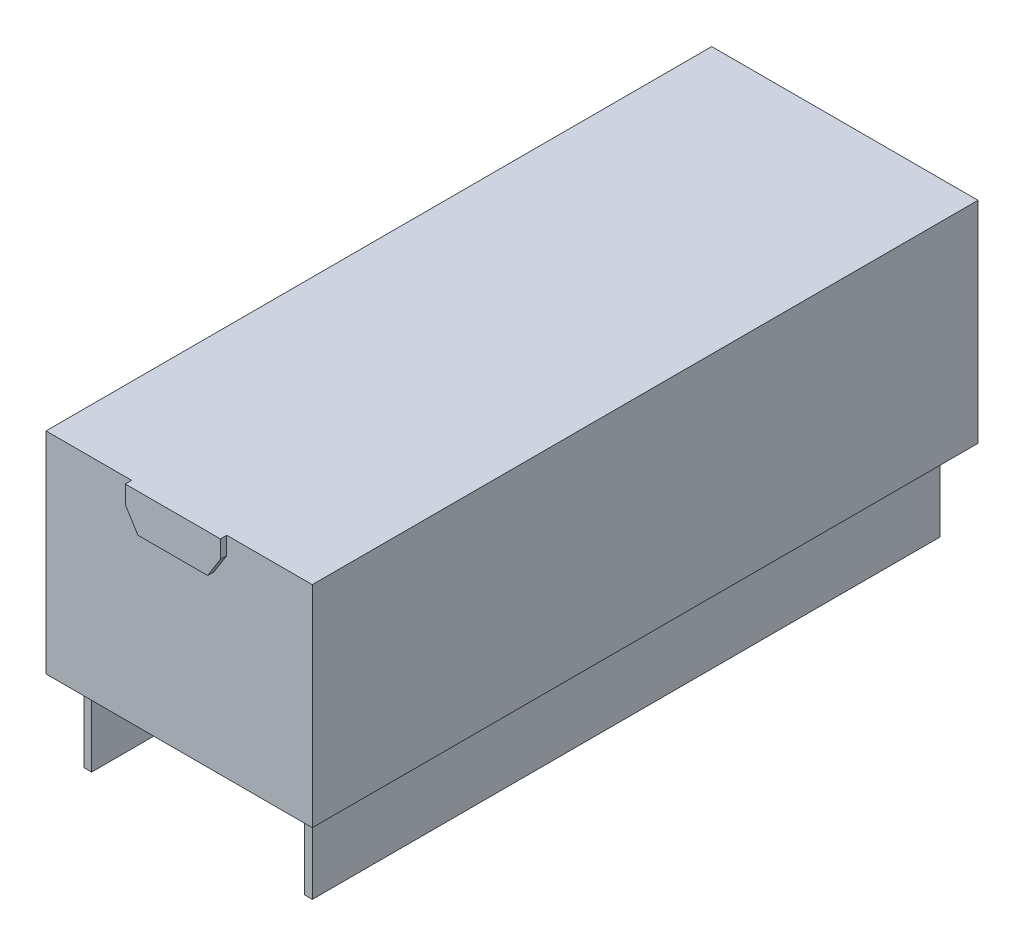
ISO-10303-21;
HEADER;
FILE_DESCRIPTION(('STEP AP214'),'2;1');
FILE_NAME('part.step','',(''),(''),'','','');
FILE_SCHEMA(('AUTOMOTIVE_DESIGN { 1 0 10303 214 1 1 1 1 }'));
ENDSEC;
DATA;
#1=APPLICATION_CONTEXT('core data for automotive mechanical design processes');
#2=APPLICATION_PROTOCOL_DEFINITION('international standard','automotive_design',2000,#1);
#3=PRODUCT_CONTEXT('',#1,'mechanical');
#4=PRODUCT('Part','Part','',(#3));
#5=PRODUCT_RELATED_PRODUCT_CATEGORY('part','',(#4));
#6=PRODUCT_DEFINITION_FORMATION('','',#4);
#7=PRODUCT_DEFINITION_CONTEXT('part definition',#1,'design');
#8=PRODUCT_DEFINITION('design','',#6,#7);
#9=PRODUCT_DEFINITION_SHAPE('','',#8);
#10=(LENGTH_UNIT() NAMED_UNIT(*) SI_UNIT(.MILLI.,.METRE.));
#11=(NAMED_UNIT(*) PLANE_ANGLE_UNIT() SI_UNIT($,.RADIAN.));
#12=(NAMED_UNIT(*) SI_UNIT($,.STERADIAN.) SOLID_ANGLE_UNIT());
#13=UNCERTAINTY_MEASURE_WITH_UNIT(LENGTH_MEASURE(1.E-05),#10,'distance_accuracy_value','');
#14=(GEOMETRIC_REPRESENTATION_CONTEXT(3) GLOBAL_UNCERTAINTY_ASSIGNED_CONTEXT((#13)) GLOBAL_UNIT_ASSIGNED_CONTEXT((#10,
#11,#12)) REPRESENTATION_CONTEXT('',''));
#15=CARTESIAN_POINT('',(0.,0.,0.));
#16=DIRECTION('',(0.,0.,1.));
#17=DIRECTION('',(1.,0.,0.));
#18=AXIS2_PLACEMENT_3D('',#15,#16,#17);
#19=CARTESIAN_POINT('',(0.,0.,0.));
#20=DIRECTION('',(0.,1.,0.));
#21=DIRECTION('',(0.,0.,1.));
#22=AXIS2_PLACEMENT_3D('',#19,#20,#21);
#23=PLANE('',#22);
#24=DIRECTION('',(0.,0.,-1.));
#25=VECTOR('',#24,1.);
#26=CARTESIAN_POINT('',(10.5,0.,-26.25));
#27=LINE('',#26,#25);
#28=CARTESIAN_POINT('',(10.5,0.,26.25));
#29=VERTEX_POINT('',#28);
#30=CARTESIAN_POINT('',(10.5,0.,-26.25));
#31=VERTEX_POINT('',#30);
#32=EDGE_CURVE('E316',#29,#31,#27,.T.);
#33=ORIENTED_EDGE('',*,*,#32,.F.);
#34=DIRECTION('',(1.,0.,0.));
#35=VECTOR('',#34,1.);
#36=CARTESIAN_POINT('',(-10.5,0.,26.25));
#37=LINE('',#36,#35);
#38=CARTESIAN_POINT('',(-10.5,0.,26.25));
#39=VERTEX_POINT('',#38);
#40=EDGE_CURVE('E322',#39,#29,#37,.T.);
#41=ORIENTED_EDGE('',*,*,#40,.F.);
#42=DIRECTION('',(0.,0.,1.));
#43=VECTOR('',#42,1.);
#44=CARTESIAN_POINT('',(-10.5,0.,-26.25));
#45=LINE('',#44,#43);
#46=CARTESIAN_POINT('',(-10.5,0.,-26.25));
#47=VERTEX_POINT('',#46);
#48=EDGE_CURVE('E340',#47,#39,#45,.T.);
#49=ORIENTED_EDGE('',*,*,#48,.F.);
#50=DIRECTION('',(-1.,0.,0.));
#51=VECTOR('',#50,1.);
#52=CARTESIAN_POINT('',(-10.5,0.,-26.25));
#53=LINE('',#52,#51);
#54=EDGE_CURVE('E337',#31,#47,#53,.T.);
#55=ORIENTED_EDGE('',*,*,#54,.F.);
#56=EDGE_LOOP('',(#33,#41,#49,#55));
#57=FACE_BOUND('',#56,.T.);
#58=DIRECTION('',(0.,0.,-1.));
#59=VECTOR('',#58,1.);
#60=CARTESIAN_POINT('',(-9.00000000000002,0.,24.75));
#61=LINE('',#60,#59);
#62=CARTESIAN_POINT('',(-9.00000000000002,0.,24.75));
#63=VERTEX_POINT('',#62);
#64=CARTESIAN_POINT('',(-8.99999999999999,0.,-24.75));
#65=VERTEX_POINT('',#64);
#66=EDGE_CURVE('E224',#63,#65,#61,.T.);
#67=ORIENTED_EDGE('',*,*,#66,.F.);
#68=DIRECTION('',(1.,0.,0.));
#69=VECTOR('',#68,1.);
#70=CARTESIAN_POINT('',(-9.00000000000002,0.,24.75));
#71=LINE('',#70,#69);
#72=CARTESIAN_POINT('',(-8.40000000000002,0.,24.75));
#73=VERTEX_POINT('',#72);
#74=EDGE_CURVE('E198',#63,#73,#71,.T.);
#75=ORIENTED_EDGE('',*,*,#74,.T.);
#76=DIRECTION('',(0.,0.,-1.));
#77=VECTOR('',#76,1.);
#78=CARTESIAN_POINT('',(-8.40000000000002,0.,24.75));
#79=LINE('',#78,#77);
#80=CARTESIAN_POINT('',(-8.39999999999999,0.,-24.75));
#81=VERTEX_POINT('',#80);
#82=EDGE_CURVE('E203',#73,#81,#79,.T.);
#83=ORIENTED_EDGE('',*,*,#82,.T.);
#84=DIRECTION('',(1.,0.,0.));
#85=VECTOR('',#84,1.);
#86=CARTESIAN_POINT('',(-8.99999999999999,0.,-24.75));
#87=LINE('',#86,#85);
#88=EDGE_CURVE('E69',#65,#81,#87,.T.);
#89=ORIENTED_EDGE('',*,*,#88,.F.);
#90=EDGE_LOOP('',(#67,#75,#83,#89));
#91=FACE_BOUND('',#90,.T.);
#92=DIRECTION('',(-1.,0.,0.));
#93=VECTOR('',#92,1.);
#94=CARTESIAN_POINT('',(9.00000000000002,0.,24.75));
#95=LINE('',#94,#93);
#96=CARTESIAN_POINT('',(9.00000000000002,0.,24.75));
#97=VERTEX_POINT('',#96);
#98=CARTESIAN_POINT('',(8.40000000000002,0.,24.75));
#99=VERTEX_POINT('',#98);
#100=EDGE_CURVE('E178',#97,#99,#95,.T.);
#101=ORIENTED_EDGE('',*,*,#100,.F.);
#102=DIRECTION('',(0.,0.,-1.));
#103=VECTOR('',#102,1.);
#104=CARTESIAN_POINT('',(9.00000000000002,0.,24.75));
#105=LINE('',#104,#103);
#106=CARTESIAN_POINT('',(8.99999999999999,0.,-24.75));
#107=VERTEX_POINT('',#106);
#108=EDGE_CURVE('E190',#97,#107,#105,.T.);
#109=ORIENTED_EDGE('',*,*,#108,.T.);
#110=DIRECTION('',(-1.,0.,0.));
#111=VECTOR('',#110,1.);
#112=CARTESIAN_POINT('',(8.99999999999999,0.,-24.75));
#113=LINE('',#112,#111);
#114=CARTESIAN_POINT('',(8.39999999999999,0.,-24.75));
#115=VERTEX_POINT('',#114);
#116=EDGE_CURVE('E61',#107,#115,#113,.T.);
#117=ORIENTED_EDGE('',*,*,#116,.T.);
#118=DIRECTION('',(0.,0.,-1.));
#119=VECTOR('',#118,1.);
#120=CARTESIAN_POINT('',(8.40000000000002,0.,24.75));
#121=LINE('',#120,#119);
#122=EDGE_CURVE('E196',#99,#115,#121,.T.);
#123=ORIENTED_EDGE('',*,*,#122,.F.);
#124=EDGE_LOOP('',(#101,#109,#117,#123));
#125=FACE_BOUND('',#124,.T.);
#126=ADVANCED_FACE('F45',(#57,#91,#125),#23,.F.);
#127=CARTESIAN_POINT('',(-10.5,16.6,26.25));
#128=DIRECTION('',(0.,0.,-1.));
#129=DIRECTION('',(-1.,0.,0.));
#130=AXIS2_PLACEMENT_3D('',#127,#128,#129);
#131=PLANE('',#130);
#132=DIRECTION('',(0.,1.,0.));
#133=VECTOR('',#132,1.);
#134=CARTESIAN_POINT('',(3.75,16.6,26.25));
#135=LINE('',#134,#133);
#136=CARTESIAN_POINT('',(3.75,15.2,26.25));
#137=VERTEX_POINT('',#136);
#138=CARTESIAN_POINT('',(3.75,16.6,26.25));
#139=VERTEX_POINT('',#138);
#140=EDGE_CURVE('E259',#137,#139,#135,.T.);
#141=ORIENTED_EDGE('',*,*,#140,.F.);
#142=DIRECTION('',(0.52999894000318,0.847998304005088,0.));
#143=VECTOR('',#142,1.);
#144=CARTESIAN_POINT('',(2.75,13.6,26.25));
#145=LINE('',#144,#143);
#146=CARTESIAN_POINT('',(2.75,13.6,26.25));
#147=VERTEX_POINT('',#146);
#148=EDGE_CURVE('E286',#147,#137,#145,.T.);
#149=ORIENTED_EDGE('',*,*,#148,.F.);
#150=DIRECTION('',(1.,0.,0.));
#151=VECTOR('',#150,1.);
#152=CARTESIAN_POINT('',(-2.75,13.6,26.25));
#153=LINE('',#152,#151);
#154=CARTESIAN_POINT('',(-2.75,13.6,26.25));
#155=VERTEX_POINT('',#154);
#156=EDGE_CURVE('E282',#155,#147,#153,.T.);
#157=ORIENTED_EDGE('',*,*,#156,.F.);
#158=DIRECTION('',(0.529998940003181,-0.847998304005087,0.));
#159=VECTOR('',#158,1.);
#160=CARTESIAN_POINT('',(-3.75,15.2,26.25));
#161=LINE('',#160,#159);
#162=CARTESIAN_POINT('',(-3.75,15.2,26.25));
#163=VERTEX_POINT('',#162);
#164=EDGE_CURVE('E278',#163,#155,#161,.T.);
#165=ORIENTED_EDGE('',*,*,#164,.F.);
#166=DIRECTION('',(0.,-1.,0.));
#167=VECTOR('',#166,1.);
#168=CARTESIAN_POINT('',(-3.75,16.6,26.25));
#169=LINE('',#168,#167);
#170=CARTESIAN_POINT('',(-3.75,16.6,26.25));
#171=VERTEX_POINT('',#170);
#172=EDGE_CURVE('E245',#171,#163,#169,.T.);
#173=ORIENTED_EDGE('',*,*,#172,.F.);
#174=DIRECTION('',(1.,0.,0.));
#175=VECTOR('',#174,1.);
#176=CARTESIAN_POINT('',(-10.5,16.6,26.25));
#177=LINE('',#176,#175);
#178=CARTESIAN_POINT('',(-10.5,16.6,26.25));
#179=VERTEX_POINT('',#178);
#180=EDGE_CURVE('E329',#179,#171,#177,.T.);
#181=ORIENTED_EDGE('',*,*,#180,.F.);
#182=DIRECTION('',(0.,-1.,0.));
#183=VECTOR('',#182,1.);
#184=CARTESIAN_POINT('',(-10.5,16.6,26.25));
#185=LINE('',#184,#183);
#186=EDGE_CURVE('E348',#179,#39,#185,.T.);
#187=ORIENTED_EDGE('',*,*,#186,.T.);
#188=ORIENTED_EDGE('',*,*,#40,.T.);
#189=DIRECTION('',(0.,-1.,0.));
#190=VECTOR('',#189,1.);
#191=CARTESIAN_POINT('',(10.5,16.6,26.25));
#192=LINE('',#191,#190);
#193=CARTESIAN_POINT('',(10.5,16.6,26.25));
#194=VERTEX_POINT('',#193);
#195=EDGE_CURVE('E333',#194,#29,#192,.T.);
#196=ORIENTED_EDGE('',*,*,#195,.F.);
#197=EDGE_CURVE('E328',#139,#194,#177,.T.);
#198=ORIENTED_EDGE('',*,*,#197,.F.);
#199=EDGE_LOOP('',(#141,#149,#157,#165,#173,#181,#187,#188,#196,#198));
#200=FACE_BOUND('',#199,.T.);
#201=ADVANCED_FACE('F366',(#200),#131,.F.);
#202=CARTESIAN_POINT('',(10.5,16.6,-26.25));
#203=DIRECTION('',(-1.,0.,0.));
#204=DIRECTION('',(0.,0.,1.));
#205=AXIS2_PLACEMENT_3D('',#202,#203,#204);
#206=PLANE('',#205);
#207=ORIENTED_EDGE('',*,*,#32,.T.);
#208=DIRECTION('',(0.,-1.,0.));
#209=VECTOR('',#208,1.);
#210=CARTESIAN_POINT('',(10.5,16.6,-26.25));
#211=LINE('',#210,#209);
#212=CARTESIAN_POINT('',(10.5,16.6,-26.25));
#213=VERTEX_POINT('',#212);
#214=EDGE_CURVE('E11',#213,#31,#211,.T.);
#215=ORIENTED_EDGE('',*,*,#214,.F.);
#216=DIRECTION('',(0.,0.,-1.));
#217=VECTOR('',#216,1.);
#218=CARTESIAN_POINT('',(10.5,16.6,-26.25));
#219=LINE('',#218,#217);
#220=EDGE_CURVE('E317',#194,#213,#219,.T.);
#221=ORIENTED_EDGE('',*,*,#220,.F.);
#222=ORIENTED_EDGE('',*,*,#195,.T.);
#223=EDGE_LOOP('',(#207,#215,#221,#222));
#224=FACE_BOUND('',#223,.T.);
#225=ADVANCED_FACE('F47',(#224),#206,.F.);
#226=CARTESIAN_POINT('',(-10.5,16.6,-26.25));
#227=DIRECTION('',(0.,0.,1.));
#228=DIRECTION('',(1.,0.,0.));
#229=AXIS2_PLACEMENT_3D('',#226,#227,#228);
#230=PLANE('',#229);
#231=ORIENTED_EDGE('',*,*,#54,.T.);
#232=DIRECTION('',(0.,-1.,0.));
#233=VECTOR('',#232,1.);
#234=CARTESIAN_POINT('',(-10.5,16.6,-26.25));
#235=LINE('',#234,#233);
#236=CARTESIAN_POINT('',(-10.5,16.6,-26.25));
#237=VERTEX_POINT('',#236);
#238=EDGE_CURVE('E54',#237,#47,#235,.T.);
#239=ORIENTED_EDGE('',*,*,#238,.F.);
#240=DIRECTION('',(-1.,0.,0.));
#241=VECTOR('',#240,1.);
#242=CARTESIAN_POINT('',(-10.5,16.6,-26.25));
#243=LINE('',#242,#241);
#244=EDGE_CURVE('E321',#213,#237,#243,.T.);
#245=ORIENTED_EDGE('',*,*,#244,.F.);
#246=ORIENTED_EDGE('',*,*,#214,.T.);
#247=EDGE_LOOP('',(#231,#239,#245,#246));
#248=FACE_BOUND('',#247,.T.);
#249=ADVANCED_FACE('F418',(#248),#230,.F.);
#250=CARTESIAN_POINT('',(-10.5,16.6,-26.25));
#251=DIRECTION('',(1.,0.,0.));
#252=DIRECTION('',(0.,0.,-1.));
#253=AXIS2_PLACEMENT_3D('',#250,#251,#252);
#254=PLANE('',#253);
#255=ORIENTED_EDGE('',*,*,#48,.T.);
#256=ORIENTED_EDGE('',*,*,#186,.F.);
#257=DIRECTION('',(0.,0.,1.));
#258=VECTOR('',#257,1.);
#259=CARTESIAN_POINT('',(-10.5,16.6,-26.25));
#260=LINE('',#259,#258);
#261=EDGE_CURVE('E325',#237,#179,#260,.T.);
#262=ORIENTED_EDGE('',*,*,#261,.F.);
#263=ORIENTED_EDGE('',*,*,#238,.T.);
#264=EDGE_LOOP('',(#255,#256,#262,#263));
#265=FACE_BOUND('',#264,.T.);
#266=ADVANCED_FACE('F357',(#265),#254,.F.);
#267=CARTESIAN_POINT('',(0.,16.6,0.));
#268=DIRECTION('',(0.,1.,0.));
#269=DIRECTION('',(0.,0.,1.));
#270=AXIS2_PLACEMENT_3D('',#267,#268,#269);
#271=PLANE('',#270);
#272=ORIENTED_EDGE('',*,*,#220,.T.);
#273=ORIENTED_EDGE('',*,*,#244,.T.);
#274=ORIENTED_EDGE('',*,*,#261,.T.);
#275=ORIENTED_EDGE('',*,*,#180,.T.);
#276=DIRECTION('',(0.,0.,-1.));
#277=VECTOR('',#276,1.);
#278=CARTESIAN_POINT('',(-3.75,16.6,26.75));
#279=LINE('',#278,#277);
#280=CARTESIAN_POINT('',(-3.75,16.6,26.75));
#281=VERTEX_POINT('',#280);
#282=EDGE_CURVE('E312',#281,#171,#279,.T.);
#283=ORIENTED_EDGE('',*,*,#282,.F.);
#284=DIRECTION('',(-1.,0.,0.));
#285=VECTOR('',#284,1.);
#286=CARTESIAN_POINT('',(-3.75,16.6,26.75));
#287=LINE('',#286,#285);
#288=CARTESIAN_POINT('',(3.75,16.6,26.75));
#289=VERTEX_POINT('',#288);
#290=EDGE_CURVE('E254',#289,#281,#287,.T.);
#291=ORIENTED_EDGE('',*,*,#290,.F.);
#292=DIRECTION('',(0.,0.,-1.));
#293=VECTOR('',#292,1.);
#294=CARTESIAN_POINT('',(3.75,16.6,26.75));
#295=LINE('',#294,#293);
#296=EDGE_CURVE('E274',#289,#139,#295,.T.);
#297=ORIENTED_EDGE('',*,*,#296,.T.);
#298=ORIENTED_EDGE('',*,*,#197,.T.);
#299=EDGE_LOOP('',(#272,#273,#274,#275,#283,#291,#297,#298));
#300=FACE_BOUND('',#299,.T.);
#301=ADVANCED_FACE('F372',(#300),#271,.T.);
#302=CARTESIAN_POINT('',(-3.75,16.6,26.75));
#303=DIRECTION('',(1.,0.,0.));
#304=DIRECTION('',(0.,0.,-1.));
#305=AXIS2_PLACEMENT_3D('',#302,#303,#304);
#306=PLANE('',#305);
#307=ORIENTED_EDGE('',*,*,#172,.T.);
#308=DIRECTION('',(0.,0.,-1.));
#309=VECTOR('',#308,1.);
#310=CARTESIAN_POINT('',(-3.75,15.2,26.75));
#311=LINE('',#310,#309);
#312=CARTESIAN_POINT('',(-3.75,15.2,26.75));
#313=VERTEX_POINT('',#312);
#314=EDGE_CURVE('E308',#313,#163,#311,.T.);
#315=ORIENTED_EDGE('',*,*,#314,.F.);
#316=DIRECTION('',(0.,-1.,0.));
#317=VECTOR('',#316,1.);
#318=CARTESIAN_POINT('',(-3.75,16.6,26.75));
#319=LINE('',#318,#317);
#320=EDGE_CURVE('E258',#281,#313,#319,.T.);
#321=ORIENTED_EDGE('',*,*,#320,.F.);
#322=ORIENTED_EDGE('',*,*,#282,.T.);
#323=EDGE_LOOP('',(#307,#315,#321,#322));
#324=FACE_BOUND('',#323,.T.);
#325=ADVANCED_FACE('F393',(#324),#306,.F.);
#326=CARTESIAN_POINT('',(-3.75,15.2,26.75));
#327=DIRECTION('',(0.847998304005087,0.529998940003181,0.));
#328=DIRECTION('',(-0.529998940003181,0.847998304005087,0.));
#329=AXIS2_PLACEMENT_3D('',#326,#327,#328);
#330=PLANE('',#329);
#331=ORIENTED_EDGE('',*,*,#164,.T.);
#332=DIRECTION('',(0.,0.,-1.));
#333=VECTOR('',#332,1.);
#334=CARTESIAN_POINT('',(-2.75,13.6,26.75));
#335=LINE('',#334,#333);
#336=CARTESIAN_POINT('',(-2.75,13.6,26.75));
#337=VERTEX_POINT('',#336);
#338=EDGE_CURVE('E304',#337,#155,#335,.T.);
#339=ORIENTED_EDGE('',*,*,#338,.F.);
#340=DIRECTION('',(0.529998940003181,-0.847998304005087,0.));
#341=VECTOR('',#340,1.);
#342=CARTESIAN_POINT('',(-3.75,15.2,26.75));
#343=LINE('',#342,#341);
#344=EDGE_CURVE('E262',#313,#337,#343,.T.);
#345=ORIENTED_EDGE('',*,*,#344,.F.);
#346=ORIENTED_EDGE('',*,*,#314,.T.);
#347=EDGE_LOOP('',(#331,#339,#345,#346));
#348=FACE_BOUND('',#347,.T.);
#349=ADVANCED_FACE('F390',(#348),#330,.F.);
#350=CARTESIAN_POINT('',(-2.75,13.6,26.75));
#351=DIRECTION('',(0.,1.,0.));
#352=DIRECTION('',(-1.,0.,0.));
#353=AXIS2_PLACEMENT_3D('',#350,#351,#352);
#354=PLANE('',#353);
#355=ORIENTED_EDGE('',*,*,#156,.T.);
#356=DIRECTION('',(0.,0.,-1.));
#357=VECTOR('',#356,1.);
#358=CARTESIAN_POINT('',(2.75,13.6,26.75));
#359=LINE('',#358,#357);
#360=CARTESIAN_POINT('',(2.75,13.6,26.75));
#361=VERTEX_POINT('',#360);
#362=EDGE_CURVE('E300',#361,#147,#359,.T.);
#363=ORIENTED_EDGE('',*,*,#362,.F.);
#364=DIRECTION('',(1.,0.,0.));
#365=VECTOR('',#364,1.);
#366=CARTESIAN_POINT('',(-2.75,13.6,26.75));
#367=LINE('',#366,#365);
#368=EDGE_CURVE('E265',#337,#361,#367,.T.);
#369=ORIENTED_EDGE('',*,*,#368,.F.);
#370=ORIENTED_EDGE('',*,*,#338,.T.);
#371=EDGE_LOOP('',(#355,#363,#369,#370));
#372=FACE_BOUND('',#371,.T.);
#373=ADVANCED_FACE('F385',(#372),#354,.F.);
#374=CARTESIAN_POINT('',(2.75,13.6,26.75));
#375=DIRECTION('',(-0.847998304005088,0.529998940003181,0.));
#376=DIRECTION('',(-0.529998940003181,-0.847998304005088,0.));
#377=AXIS2_PLACEMENT_3D('',#374,#375,#376);
#378=PLANE('',#377);
#379=ORIENTED_EDGE('',*,*,#148,.T.);
#380=DIRECTION('',(0.,0.,-1.));
#381=VECTOR('',#380,1.);
#382=CARTESIAN_POINT('',(3.75,15.2,26.75));
#383=LINE('',#382,#381);
#384=CARTESIAN_POINT('',(3.75,15.2,26.75));
#385=VERTEX_POINT('',#384);
#386=EDGE_CURVE('E296',#385,#137,#383,.T.);
#387=ORIENTED_EDGE('',*,*,#386,.F.);
#388=DIRECTION('',(0.52999894000318,0.847998304005088,0.));
#389=VECTOR('',#388,1.);
#390=CARTESIAN_POINT('',(2.75,13.6,26.75));
#391=LINE('',#390,#389);
#392=EDGE_CURVE('E268',#361,#385,#391,.T.);
#393=ORIENTED_EDGE('',*,*,#392,.F.);
#394=ORIENTED_EDGE('',*,*,#362,.T.);
#395=EDGE_LOOP('',(#379,#387,#393,#394));
#396=FACE_BOUND('',#395,.T.);
#397=ADVANCED_FACE('F382',(#396),#378,.F.);
#398=CARTESIAN_POINT('',(3.75,16.6,26.75));
#399=DIRECTION('',(-1.,0.,0.));
#400=DIRECTION('',(0.,0.,1.));
#401=AXIS2_PLACEMENT_3D('',#398,#399,#400);
#402=PLANE('',#401);
#403=ORIENTED_EDGE('',*,*,#140,.T.);
#404=ORIENTED_EDGE('',*,*,#296,.F.);
#405=DIRECTION('',(0.,1.,0.));
#406=VECTOR('',#405,1.);
#407=CARTESIAN_POINT('',(3.75,16.6,26.75));
#408=LINE('',#407,#406);
#409=EDGE_CURVE('E271',#385,#289,#408,.T.);
#410=ORIENTED_EDGE('',*,*,#409,.F.);
#411=ORIENTED_EDGE('',*,*,#386,.T.);
#412=EDGE_LOOP('',(#403,#404,#410,#411));
#413=FACE_BOUND('',#412,.T.);
#414=ADVANCED_FACE('F377',(#413),#402,.F.);
#415=CARTESIAN_POINT('',(0.,0.,26.75));
#416=DIRECTION('',(0.,0.,-1.));
#417=DIRECTION('',(-1.,0.,0.));
#418=AXIS2_PLACEMENT_3D('',#415,#416,#417);
#419=PLANE('',#418);
#420=ORIENTED_EDGE('',*,*,#290,.T.);
#421=ORIENTED_EDGE('',*,*,#320,.T.);
#422=ORIENTED_EDGE('',*,*,#344,.T.);
#423=ORIENTED_EDGE('',*,*,#368,.T.);
#424=ORIENTED_EDGE('',*,*,#392,.T.);
#425=ORIENTED_EDGE('',*,*,#409,.T.);
#426=EDGE_LOOP('',(#420,#421,#422,#423,#424,#425));
#427=FACE_BOUND('',#426,.T.);
#428=ADVANCED_FACE('F396',(#427),#419,.F.);
#429=CARTESIAN_POINT('',(-9.00000000000002,-6.4,24.75));
#430=DIRECTION('',(0.,0.,1.));
#431=DIRECTION('',(1.,0.,0.));
#432=AXIS2_PLACEMENT_3D('',#429,#430,#431);
#433=PLANE('',#432);
#434=ORIENTED_EDGE('',*,*,#74,.F.);
#435=DIRECTION('',(0.,1.,0.));
#436=VECTOR('',#435,1.);
#437=CARTESIAN_POINT('',(-9.00000000000002,-6.4,24.75));
#438=LINE('',#437,#436);
#439=CARTESIAN_POINT('',(-9.00000000000002,-6.4,24.75));
#440=VERTEX_POINT('',#439);
#441=EDGE_CURVE('E242',#440,#63,#438,.T.);
#442=ORIENTED_EDGE('',*,*,#441,.F.);
#443=DIRECTION('',(1.,0.,0.));
#444=VECTOR('',#443,1.);
#445=CARTESIAN_POINT('',(-9.00000000000002,-6.4,24.75));
#446=LINE('',#445,#444);
#447=CARTESIAN_POINT('',(-8.40000000000002,-6.4,24.75));
#448=VERTEX_POINT('',#447);
#449=EDGE_CURVE('E219',#440,#448,#446,.T.);
#450=ORIENTED_EDGE('',*,*,#449,.T.);
#451=DIRECTION('',(0.,1.,0.));
#452=VECTOR('',#451,1.);
#453=CARTESIAN_POINT('',(-8.40000000000002,-6.4,24.75));
#454=LINE('',#453,#452);
#455=EDGE_CURVE('E233',#448,#73,#454,.T.);
#456=ORIENTED_EDGE('',*,*,#455,.T.);
#457=EDGE_LOOP('',(#434,#442,#450,#456));
#458=FACE_BOUND('',#457,.T.);
#459=ADVANCED_FACE('F398',(#458),#433,.T.);
#460=CARTESIAN_POINT('',(-9.00000000000002,-6.4,24.75));
#461=DIRECTION('',(1.,0.,0.));
#462=DIRECTION('',(0.,0.,-1.));
#463=AXIS2_PLACEMENT_3D('',#460,#461,#462);
#464=PLANE('',#463);
#465=ORIENTED_EDGE('',*,*,#66,.T.);
#466=DIRECTION('',(0.,1.,0.));
#467=VECTOR('',#466,1.);
#468=CARTESIAN_POINT('',(-8.99999999999999,-6.4,-24.75));
#469=LINE('',#468,#467);
#470=CARTESIAN_POINT('',(-8.99999999999999,-6.4,-24.75));
#471=VERTEX_POINT('',#470);
#472=EDGE_CURVE('E246',#471,#65,#469,.T.);
#473=ORIENTED_EDGE('',*,*,#472,.F.);
#474=DIRECTION('',(0.,0.,-1.));
#475=VECTOR('',#474,1.);
#476=CARTESIAN_POINT('',(-9.00000000000002,-6.4,24.75));
#477=LINE('',#476,#475);
#478=EDGE_CURVE('E231',#440,#471,#477,.T.);
#479=ORIENTED_EDGE('',*,*,#478,.F.);
#480=ORIENTED_EDGE('',*,*,#441,.T.);
#481=EDGE_LOOP('',(#465,#473,#479,#480));
#482=FACE_BOUND('',#481,.T.);
#483=ADVANCED_FACE('F405',(#482),#464,.F.);
#484=CARTESIAN_POINT('',(-8.99999999999999,-6.4,-24.75));
#485=DIRECTION('',(0.,0.,1.));
#486=DIRECTION('',(1.,0.,0.));
#487=AXIS2_PLACEMENT_3D('',#484,#485,#486);
#488=PLANE('',#487);
#489=ORIENTED_EDGE('',*,*,#88,.T.);
#490=DIRECTION('',(0.,1.,0.));
#491=VECTOR('',#490,1.);
#492=CARTESIAN_POINT('',(-8.39999999999999,-6.4,-24.75));
#493=LINE('',#492,#491);
#494=CARTESIAN_POINT('',(-8.39999999999999,-6.4,-24.75));
#495=VERTEX_POINT('',#494);
#496=EDGE_CURVE('E249',#495,#81,#493,.T.);
#497=ORIENTED_EDGE('',*,*,#496,.F.);
#498=DIRECTION('',(1.,0.,0.));
#499=VECTOR('',#498,1.);
#500=CARTESIAN_POINT('',(-8.99999999999999,-6.4,-24.75));
#501=LINE('',#500,#499);
#502=EDGE_CURVE('E228',#471,#495,#501,.T.);
#503=ORIENTED_EDGE('',*,*,#502,.F.);
#504=ORIENTED_EDGE('',*,*,#472,.T.);
#505=EDGE_LOOP('',(#489,#497,#503,#504));
#506=FACE_BOUND('',#505,.T.);
#507=ADVANCED_FACE('F504',(#506),#488,.F.);
#508=CARTESIAN_POINT('',(-8.40000000000002,-6.4,24.75));
#509=DIRECTION('',(1.,0.,0.));
#510=DIRECTION('',(0.,0.,-1.));
#511=AXIS2_PLACEMENT_3D('',#508,#509,#510);
#512=PLANE('',#511);
#513=ORIENTED_EDGE('',*,*,#82,.F.);
#514=ORIENTED_EDGE('',*,*,#455,.F.);
#515=DIRECTION('',(0.,0.,-1.));
#516=VECTOR('',#515,1.);
#517=CARTESIAN_POINT('',(-8.40000000000002,-6.4,24.75));
#518=LINE('',#517,#516);
#519=EDGE_CURVE('E223',#448,#495,#518,.T.);
#520=ORIENTED_EDGE('',*,*,#519,.T.);
#521=ORIENTED_EDGE('',*,*,#496,.T.);
#522=EDGE_LOOP('',(#513,#514,#520,#521));
#523=FACE_BOUND('',#522,.T.);
#524=ADVANCED_FACE('F513',(#523),#512,.T.);
#525=CARTESIAN_POINT('',(0.,-6.4,0.));
#526=DIRECTION('',(0.,1.,0.));
#527=DIRECTION('',(0.,0.,1.));
#528=AXIS2_PLACEMENT_3D('',#525,#526,#527);
#529=PLANE('',#528);
#530=ORIENTED_EDGE('',*,*,#449,.F.);
#531=ORIENTED_EDGE('',*,*,#478,.T.);
#532=ORIENTED_EDGE('',*,*,#502,.T.);
#533=ORIENTED_EDGE('',*,*,#519,.F.);
#534=EDGE_LOOP('',(#530,#531,#532,#533));
#535=FACE_BOUND('',#534,.T.);
#536=ADVANCED_FACE('F521',(#535),#529,.F.);
#537=CARTESIAN_POINT('',(9.00000000000002,-6.4,24.75));
#538=DIRECTION('',(0.,0.,-1.));
#539=DIRECTION('',(-1.,0.,0.));
#540=AXIS2_PLACEMENT_3D('',#537,#538,#539);
#541=PLANE('',#540);
#542=ORIENTED_EDGE('',*,*,#100,.T.);
#543=DIRECTION('',(0.,1.,0.));
#544=VECTOR('',#543,1.);
#545=CARTESIAN_POINT('',(8.40000000000002,-6.4,24.75));
#546=LINE('',#545,#544);
#547=CARTESIAN_POINT('',(8.40000000000002,-6.4,24.75));
#548=VERTEX_POINT('',#547);
#549=EDGE_CURVE('E585',#548,#99,#546,.T.);
#550=ORIENTED_EDGE('',*,*,#549,.F.);
#551=DIRECTION('',(-1.,0.,0.));
#552=VECTOR('',#551,1.);
#553=CARTESIAN_POINT('',(9.00000000000002,-6.4,24.75));
#554=LINE('',#553,#552);
#555=CARTESIAN_POINT('',(9.00000000000002,-6.4,24.75));
#556=VERTEX_POINT('',#555);
#557=EDGE_CURVE('E181',#556,#548,#554,.T.);
#558=ORIENTED_EDGE('',*,*,#557,.F.);
#559=DIRECTION('',(0.,1.,0.));
#560=VECTOR('',#559,1.);
#561=CARTESIAN_POINT('',(9.00000000000002,-6.4,24.75));
#562=LINE('',#561,#560);
#563=EDGE_CURVE('E173',#556,#97,#562,.T.);
#564=ORIENTED_EDGE('',*,*,#563,.T.);
#565=EDGE_LOOP('',(#542,#550,#558,#564));
#566=FACE_BOUND('',#565,.T.);
#567=ADVANCED_FACE('F175',(#566),#541,.F.);
#568=CARTESIAN_POINT('',(8.40000000000002,-6.4,24.75));
#569=DIRECTION('',(1.,0.,0.));
#570=DIRECTION('',(0.,0.,-1.));
#571=AXIS2_PLACEMENT_3D('',#568,#569,#570);
#572=PLANE('',#571);
#573=ORIENTED_EDGE('',*,*,#122,.T.);
#574=DIRECTION('',(0.,1.,0.));
#575=VECTOR('',#574,1.);
#576=CARTESIAN_POINT('',(8.39999999999999,-6.4,-24.75));
#577=LINE('',#576,#575);
#578=CARTESIAN_POINT('',(8.39999999999999,-6.4,-24.75));
#579=VERTEX_POINT('',#578);
#580=EDGE_CURVE('E587',#579,#115,#577,.T.);
#581=ORIENTED_EDGE('',*,*,#580,.F.);
#582=DIRECTION('',(0.,0.,-1.));
#583=VECTOR('',#582,1.);
#584=CARTESIAN_POINT('',(8.40000000000002,-6.4,24.75));
#585=LINE('',#584,#583);
#586=EDGE_CURVE('E214',#548,#579,#585,.T.);
#587=ORIENTED_EDGE('',*,*,#586,.F.);
#588=ORIENTED_EDGE('',*,*,#549,.T.);
#589=EDGE_LOOP('',(#573,#581,#587,#588));
#590=FACE_BOUND('',#589,.T.);
#591=ADVANCED_FACE('F538',(#590),#572,.F.);
#592=CARTESIAN_POINT('',(8.99999999999999,-6.4,-24.75));
#593=DIRECTION('',(0.,0.,-1.));
#594=DIRECTION('',(-1.,0.,0.));
#595=AXIS2_PLACEMENT_3D('',#592,#593,#594);
#596=PLANE('',#595);
#597=ORIENTED_EDGE('',*,*,#116,.F.);
#598=DIRECTION('',(0.,1.,0.));
#599=VECTOR('',#598,1.);
#600=CARTESIAN_POINT('',(8.99999999999999,-6.4,-24.75));
#601=LINE('',#600,#599);
#602=CARTESIAN_POINT('',(8.99999999999999,-6.4,-24.75));
#603=VERTEX_POINT('',#602);
#604=EDGE_CURVE('E187',#603,#107,#601,.T.);
#605=ORIENTED_EDGE('',*,*,#604,.F.);
#606=DIRECTION('',(-1.,0.,0.));
#607=VECTOR('',#606,1.);
#608=CARTESIAN_POINT('',(8.99999999999999,-6.4,-24.75));
#609=LINE('',#608,#607);
#610=EDGE_CURVE('E210',#603,#579,#609,.T.);
#611=ORIENTED_EDGE('',*,*,#610,.T.);
#612=ORIENTED_EDGE('',*,*,#580,.T.);
#613=EDGE_LOOP('',(#597,#605,#611,#612));
#614=FACE_BOUND('',#613,.T.);
#615=ADVANCED_FACE('F546',(#614),#596,.T.);
#616=CARTESIAN_POINT('',(9.00000000000002,-6.4,24.75));
#617=DIRECTION('',(1.,0.,0.));
#618=DIRECTION('',(0.,0.,-1.));
#619=AXIS2_PLACEMENT_3D('',#616,#617,#618);
#620=PLANE('',#619);
#621=ORIENTED_EDGE('',*,*,#108,.F.);
#622=ORIENTED_EDGE('',*,*,#563,.F.);
#623=DIRECTION('',(0.,0.,-1.));
#624=VECTOR('',#623,1.);
#625=CARTESIAN_POINT('',(9.00000000000002,-6.4,24.75));
#626=LINE('',#625,#624);
#627=EDGE_CURVE('E186',#556,#603,#626,.T.);
#628=ORIENTED_EDGE('',*,*,#627,.T.);
#629=ORIENTED_EDGE('',*,*,#604,.T.);
#630=EDGE_LOOP('',(#621,#622,#628,#629));
#631=FACE_BOUND('',#630,.T.);
#632=ADVANCED_FACE('F191',(#631),#620,.T.);
#633=CARTESIAN_POINT('',(0.,-6.4,0.));
#634=DIRECTION('',(0.,-1.,0.));
#635=DIRECTION('',(0.,0.,-1.));
#636=AXIS2_PLACEMENT_3D('',#633,#634,#635);
#637=PLANE('',#636);
#638=ORIENTED_EDGE('',*,*,#557,.T.);
#639=ORIENTED_EDGE('',*,*,#586,.T.);
#640=ORIENTED_EDGE('',*,*,#610,.F.);
#641=ORIENTED_EDGE('',*,*,#627,.F.);
#642=EDGE_LOOP('',(#638,#639,#640,#641));
#643=FACE_BOUND('',#642,.T.);
#644=ADVANCED_FACE('F562',(#643),#637,.T.);
#645=CLOSED_SHELL('',(#126,#201,#225,#249,#266,#301,#325,#349,#373,#397,#414,#428,#459,#483,
#507,#524,#536,#567,#591,#615,#632,#644));
#646=MANIFOLD_SOLID_BREP('B2',#645);
#647=ADVANCED_BREP_SHAPE_REPRESENTATION('',(#18,#646),#14);
#648=SHAPE_DEFINITION_REPRESENTATION(#9,#647);
ENDSEC;
END-ISO-10303-21;
